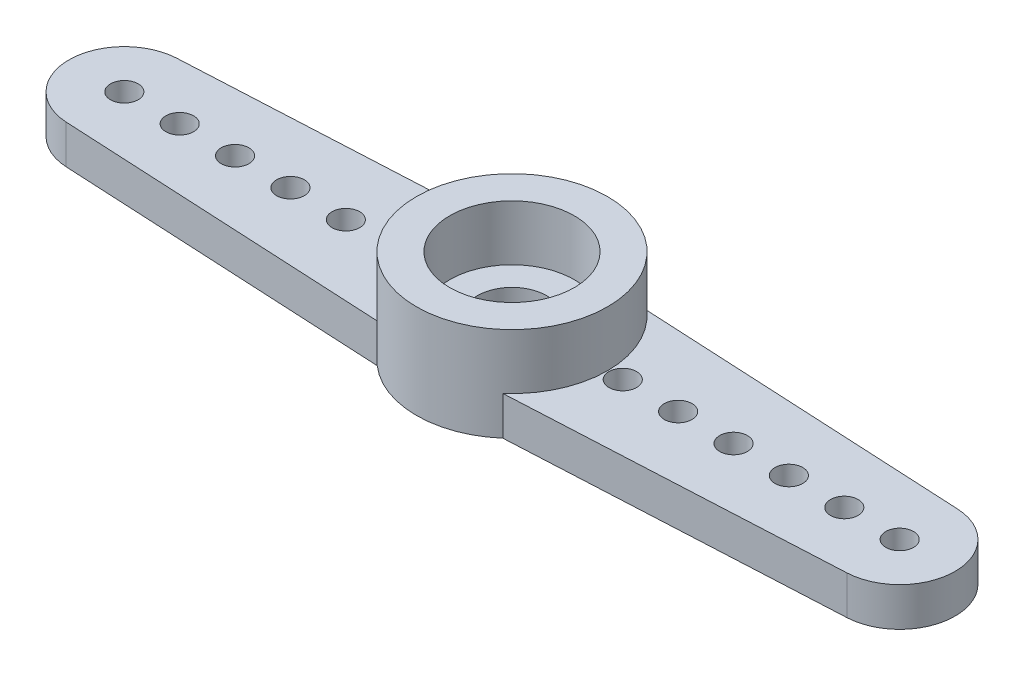
ISO-10303-21;
HEADER;
FILE_DESCRIPTION(('STEP AP214'),'2;1');
FILE_NAME('part.step','',(''),(''),'','','');
FILE_SCHEMA(('AUTOMOTIVE_DESIGN { 1 0 10303 214 1 1 1 1 }'));
ENDSEC;
DATA;
#1=APPLICATION_CONTEXT('core data for automotive mechanical design processes');
#2=APPLICATION_PROTOCOL_DEFINITION('international standard','automotive_design',2000,#1);
#3=PRODUCT_CONTEXT('',#1,'mechanical');
#4=PRODUCT('Part','Part','',(#3));
#5=PRODUCT_RELATED_PRODUCT_CATEGORY('part','',(#4));
#6=PRODUCT_DEFINITION_FORMATION('','',#4);
#7=PRODUCT_DEFINITION_CONTEXT('part definition',#1,'design');
#8=PRODUCT_DEFINITION('design','',#6,#7);
#9=PRODUCT_DEFINITION_SHAPE('','',#8);
#10=(LENGTH_UNIT() NAMED_UNIT(*) SI_UNIT(.MILLI.,.METRE.));
#11=(NAMED_UNIT(*) PLANE_ANGLE_UNIT() SI_UNIT($,.RADIAN.));
#12=(NAMED_UNIT(*) SI_UNIT($,.STERADIAN.) SOLID_ANGLE_UNIT());
#13=UNCERTAINTY_MEASURE_WITH_UNIT(LENGTH_MEASURE(1.E-05),#10,'distance_accuracy_value','');
#14=(GEOMETRIC_REPRESENTATION_CONTEXT(3) GLOBAL_UNCERTAINTY_ASSIGNED_CONTEXT((#13)) GLOBAL_UNIT_ASSIGNED_CONTEXT((#10,
#11,#12)) REPRESENTATION_CONTEXT('',''));
#15=CARTESIAN_POINT('',(0.,0.,0.));
#16=DIRECTION('',(0.,0.,1.));
#17=DIRECTION('',(1.,0.,0.));
#18=AXIS2_PLACEMENT_3D('',#15,#16,#17);
#19=CARTESIAN_POINT('',(-14.,1.4,0.));
#20=DIRECTION('',(0.,1.,0.));
#21=DIRECTION('',(0.,0.,1.));
#22=AXIS2_PLACEMENT_3D('',#19,#20,#21);
#23=PLANE('',#22);
#24=CARTESIAN_POINT('',(4.,1.4,0.));
#25=DIRECTION('',(0.,1.,0.));
#26=DIRECTION('',(0.,0.,1.));
#27=AXIS2_PLACEMENT_3D('',#24,#25,#26);
#28=CIRCLE('',#27,0.5);
#29=CARTESIAN_POINT('',(4.,1.4,0.5));
#30=VERTEX_POINT('',#29);
#31=EDGE_CURVE('E477',#30,#30,#28,.F.);
#32=ORIENTED_EDGE('',*,*,#31,.T.);
#33=EDGE_LOOP('',(#32));
#34=FACE_BOUND('',#33,.T.);
#35=CARTESIAN_POINT('',(6.,1.4,0.));
#36=DIRECTION('',(0.,1.,0.));
#37=DIRECTION('',(0.,0.,1.));
#38=AXIS2_PLACEMENT_3D('',#35,#36,#37);
#39=CIRCLE('',#38,0.5);
#40=CARTESIAN_POINT('',(6.,1.4,0.499999999999986));
#41=VERTEX_POINT('',#40);
#42=EDGE_CURVE('E510',#41,#41,#39,.F.);
#43=ORIENTED_EDGE('',*,*,#42,.T.);
#44=EDGE_LOOP('',(#43));
#45=FACE_BOUND('',#44,.T.);
#46=CARTESIAN_POINT('',(8.,1.4,0.));
#47=DIRECTION('',(0.,1.,0.));
#48=DIRECTION('',(0.,0.,1.));
#49=AXIS2_PLACEMENT_3D('',#46,#47,#48);
#50=CIRCLE('',#49,0.5);
#51=CARTESIAN_POINT('',(8.,1.4,0.499999999999972));
#52=VERTEX_POINT('',#51);
#53=EDGE_CURVE('E507',#52,#52,#50,.F.);
#54=ORIENTED_EDGE('',*,*,#53,.T.);
#55=EDGE_LOOP('',(#54));
#56=FACE_BOUND('',#55,.T.);
#57=CARTESIAN_POINT('',(10.,1.4,0.));
#58=DIRECTION('',(0.,1.,0.));
#59=DIRECTION('',(0.,0.,1.));
#60=AXIS2_PLACEMENT_3D('',#57,#58,#59);
#61=CIRCLE('',#60,0.500000000000001);
#62=CARTESIAN_POINT('',(10.,1.4,0.499999999999959));
#63=VERTEX_POINT('',#62);
#64=EDGE_CURVE('E504',#63,#63,#61,.F.);
#65=ORIENTED_EDGE('',*,*,#64,.T.);
#66=EDGE_LOOP('',(#65));
#67=FACE_BOUND('',#66,.T.);
#68=CARTESIAN_POINT('',(12.,1.4,0.));
#69=DIRECTION('',(0.,1.,0.));
#70=DIRECTION('',(0.,0.,1.));
#71=AXIS2_PLACEMENT_3D('',#68,#69,#70);
#72=CIRCLE('',#71,0.499999999999999);
#73=CARTESIAN_POINT('',(12.,1.4,0.499999999999943));
#74=VERTEX_POINT('',#73);
#75=EDGE_CURVE('E485',#74,#74,#72,.F.);
#76=ORIENTED_EDGE('',*,*,#75,.T.);
#77=EDGE_LOOP('',(#76));
#78=FACE_BOUND('',#77,.T.);
#79=CARTESIAN_POINT('',(14.,1.4,0.));
#80=DIRECTION('',(0.,1.,0.));
#81=DIRECTION('',(0.,0.,1.));
#82=AXIS2_PLACEMENT_3D('',#79,#80,#81);
#83=CIRCLE('',#82,0.500000000000001);
#84=CARTESIAN_POINT('',(14.,1.4,0.499999999999931));
#85=VERTEX_POINT('',#84);
#86=EDGE_CURVE('E481',#85,#85,#83,.F.);
#87=ORIENTED_EDGE('',*,*,#86,.T.);
#88=EDGE_LOOP('',(#87));
#89=FACE_BOUND('',#88,.T.);
#90=CARTESIAN_POINT('',(0.,1.4,0.));
#91=DIRECTION('',(0.,1.,0.));
#92=DIRECTION('',(0.,0.,1.));
#93=AXIS2_PLACEMENT_3D('',#90,#91,#92);
#94=CIRCLE('',#93,3.45);
#95=CARTESIAN_POINT('',(2.26770809408971,1.4,2.6));
#96=VERTEX_POINT('',#95);
#97=CARTESIAN_POINT('',(2.26770809408971,1.4,-2.6));
#98=VERTEX_POINT('',#97);
#99=EDGE_CURVE('E45',#96,#98,#94,.T.);
#100=ORIENTED_EDGE('',*,*,#99,.F.);
#101=DIRECTION('',(0.998706090170372,0.,-0.050854158695319));
#102=VECTOR('',#101,1.);
#103=CARTESIAN_POINT('',(14.1017083173906,1.4,1.99741218034074));
#104=LINE('',#103,#102);
#105=CARTESIAN_POINT('',(14.1017083173906,1.4,1.99741218034074));
#106=VERTEX_POINT('',#105);
#107=EDGE_CURVE('E145',#96,#106,#104,.T.);
#108=ORIENTED_EDGE('',*,*,#107,.T.);
#109=CARTESIAN_POINT('',(14.,1.4,0.));
#110=DIRECTION('',(0.,1.,0.));
#111=DIRECTION('',(0.,0.,-1.));
#112=AXIS2_PLACEMENT_3D('',#109,#110,#111);
#113=CIRCLE('',#112,2.);
#114=CARTESIAN_POINT('',(14.1017083173906,1.4,-1.99741218034074));
#115=VERTEX_POINT('',#114);
#116=EDGE_CURVE('E115',#106,#115,#113,.T.);
#117=ORIENTED_EDGE('',*,*,#116,.T.);
#118=DIRECTION('',(-0.998706090170372,0.,-0.050854158695319));
#119=VECTOR('',#118,1.);
#120=CARTESIAN_POINT('',(2.26770809408971,1.4,-2.6));
#121=LINE('',#120,#119);
#122=EDGE_CURVE('E111',#115,#98,#121,.T.);
#123=ORIENTED_EDGE('',*,*,#122,.T.);
#124=EDGE_LOOP('',(#100,#108,#117,#123));
#125=FACE_BOUND('',#124,.T.);
#126=ADVANCED_FACE('F33',(#34,#45,#56,#67,#78,#89,#125),#23,.T.);
#127=CARTESIAN_POINT('',(-14.,1.4,0.));
#128=DIRECTION('',(0.,-1.,0.));
#129=DIRECTION('',(0.,0.,-1.));
#130=AXIS2_PLACEMENT_3D('',#127,#128,#129);
#131=CYLINDRICAL_SURFACE('',#130,2.);
#132=CARTESIAN_POINT('',(-14.,0.,0.));
#133=DIRECTION('',(0.,1.,0.));
#134=DIRECTION('',(0.,0.,1.));
#135=AXIS2_PLACEMENT_3D('',#132,#133,#134);
#136=CIRCLE('',#135,2.);
#137=CARTESIAN_POINT('',(-14.1017083173906,0.,-1.99741218034074));
#138=VERTEX_POINT('',#137);
#139=CARTESIAN_POINT('',(-14.1017083173906,0.,1.99741218034074));
#140=VERTEX_POINT('',#139);
#141=EDGE_CURVE('E135',#138,#140,#136,.T.);
#142=ORIENTED_EDGE('',*,*,#141,.T.);
#143=DIRECTION('',(0.,-1.,0.));
#144=VECTOR('',#143,1.);
#145=CARTESIAN_POINT('',(-14.1017083173906,1.4,1.99741218034074));
#146=LINE('',#145,#144);
#147=CARTESIAN_POINT('',(-14.1017083173906,1.4,1.99741218034074));
#148=VERTEX_POINT('',#147);
#149=EDGE_CURVE('E43',#148,#140,#146,.T.);
#150=ORIENTED_EDGE('',*,*,#149,.F.);
#151=CARTESIAN_POINT('',(-14.,1.4,0.));
#152=DIRECTION('',(0.,1.,0.));
#153=DIRECTION('',(0.,0.,1.));
#154=AXIS2_PLACEMENT_3D('',#151,#152,#153);
#155=CIRCLE('',#154,2.);
#156=CARTESIAN_POINT('',(-14.1017083173906,1.4,-1.99741218034074));
#157=VERTEX_POINT('',#156);
#158=EDGE_CURVE('E142',#157,#148,#155,.T.);
#159=ORIENTED_EDGE('',*,*,#158,.F.);
#160=DIRECTION('',(0.,-1.,0.));
#161=VECTOR('',#160,1.);
#162=CARTESIAN_POINT('',(-14.1017083173906,1.4,-1.99741218034074));
#163=LINE('',#162,#161);
#164=EDGE_CURVE('E149',#157,#138,#163,.T.);
#165=ORIENTED_EDGE('',*,*,#164,.T.);
#166=EDGE_LOOP('',(#142,#150,#159,#165));
#167=FACE_BOUND('',#166,.T.);
#168=ADVANCED_FACE('F35',(#167),#131,.T.);
#169=CARTESIAN_POINT('',(-2.26770809408971,1.4,2.6));
#170=DIRECTION('',(0.050854158695319,0.,-0.998706090170372));
#171=DIRECTION('',(-0.998706090170372,0.,-0.050854158695319));
#172=AXIS2_PLACEMENT_3D('',#169,#170,#171);
#173=PLANE('',#172);
#174=DIRECTION('',(0.998706090170372,0.,0.050854158695319));
#175=VECTOR('',#174,1.);
#176=CARTESIAN_POINT('',(-2.26770809408971,0.,2.6));
#177=LINE('',#176,#175);
#178=CARTESIAN_POINT('',(-2.26770809408971,0.,2.6));
#179=VERTEX_POINT('',#178);
#180=EDGE_CURVE('E152',#140,#179,#177,.T.);
#181=ORIENTED_EDGE('',*,*,#180,.T.);
#182=DIRECTION('',(0.,-1.,0.));
#183=VECTOR('',#182,1.);
#184=CARTESIAN_POINT('',(-2.26770809408971,1.4,2.6));
#185=LINE('',#184,#183);
#186=CARTESIAN_POINT('',(-2.26770809408971,1.4,2.6));
#187=VERTEX_POINT('',#186);
#188=EDGE_CURVE('E170',#187,#179,#185,.T.);
#189=ORIENTED_EDGE('',*,*,#188,.F.);
#190=DIRECTION('',(0.998706090170372,0.,0.050854158695319));
#191=VECTOR('',#190,1.);
#192=CARTESIAN_POINT('',(-2.26770809408971,1.4,2.6));
#193=LINE('',#192,#191);
#194=EDGE_CURVE('E98',#148,#187,#193,.T.);
#195=ORIENTED_EDGE('',*,*,#194,.F.);
#196=ORIENTED_EDGE('',*,*,#149,.T.);
#197=EDGE_LOOP('',(#181,#189,#195,#196));
#198=FACE_BOUND('',#197,.T.);
#199=ADVANCED_FACE('F173',(#198),#173,.F.);
#200=CARTESIAN_POINT('',(14.1017083173906,1.4,1.99741218034074));
#201=DIRECTION('',(-0.050854158695319,0.,-0.998706090170372));
#202=DIRECTION('',(-0.998706090170372,0.,0.050854158695319));
#203=AXIS2_PLACEMENT_3D('',#200,#201,#202);
#204=PLANE('',#203);
#205=DIRECTION('',(0.998706090170372,0.,-0.050854158695319));
#206=VECTOR('',#205,1.);
#207=CARTESIAN_POINT('',(14.1017083173906,0.,1.99741218034074));
#208=LINE('',#207,#206);
#209=CARTESIAN_POINT('',(2.26770809408971,0.,2.6));
#210=VERTEX_POINT('',#209);
#211=CARTESIAN_POINT('',(14.1017083173906,0.,1.99741218034074));
#212=VERTEX_POINT('',#211);
#213=EDGE_CURVE('E156',#210,#212,#208,.T.);
#214=ORIENTED_EDGE('',*,*,#213,.T.);
#215=DIRECTION('',(0.,-1.,0.));
#216=VECTOR('',#215,1.);
#217=CARTESIAN_POINT('',(14.1017083173906,1.4,1.99741218034074));
#218=LINE('',#217,#216);
#219=EDGE_CURVE('E166',#106,#212,#218,.T.);
#220=ORIENTED_EDGE('',*,*,#219,.F.);
#221=ORIENTED_EDGE('',*,*,#107,.F.);
#222=DIRECTION('',(0.,-1.,0.));
#223=VECTOR('',#222,1.);
#224=CARTESIAN_POINT('',(2.26770809408971,1.4,2.6));
#225=LINE('',#224,#223);
#226=EDGE_CURVE('E131',#96,#210,#225,.T.);
#227=ORIENTED_EDGE('',*,*,#226,.T.);
#228=EDGE_LOOP('',(#214,#220,#221,#227));
#229=FACE_BOUND('',#228,.T.);
#230=ADVANCED_FACE('F184',(#229),#204,.F.);
#231=CARTESIAN_POINT('',(14.,1.4,0.));
#232=DIRECTION('',(0.,-1.,0.));
#233=DIRECTION('',(0.,0.,-1.));
#234=AXIS2_PLACEMENT_3D('',#231,#232,#233);
#235=CYLINDRICAL_SURFACE('',#234,2.);
#236=CARTESIAN_POINT('',(14.,0.,0.));
#237=DIRECTION('',(0.,1.,0.));
#238=DIRECTION('',(0.,0.,-1.));
#239=AXIS2_PLACEMENT_3D('',#236,#237,#238);
#240=CIRCLE('',#239,2.);
#241=CARTESIAN_POINT('',(14.1017083173906,0.,-1.99741218034074));
#242=VERTEX_POINT('',#241);
#243=EDGE_CURVE('E158',#212,#242,#240,.T.);
#244=ORIENTED_EDGE('',*,*,#243,.T.);
#245=DIRECTION('',(0.,-1.,0.));
#246=VECTOR('',#245,1.);
#247=CARTESIAN_POINT('',(14.1017083173906,1.4,-1.99741218034074));
#248=LINE('',#247,#246);
#249=EDGE_CURVE('E124',#115,#242,#248,.T.);
#250=ORIENTED_EDGE('',*,*,#249,.F.);
#251=ORIENTED_EDGE('',*,*,#116,.F.);
#252=ORIENTED_EDGE('',*,*,#219,.T.);
#253=EDGE_LOOP('',(#244,#250,#251,#252));
#254=FACE_BOUND('',#253,.T.);
#255=ADVANCED_FACE('F187',(#254),#235,.T.);
#256=CARTESIAN_POINT('',(2.26770809408971,1.4,-2.6));
#257=DIRECTION('',(-0.050854158695319,0.,0.998706090170372));
#258=DIRECTION('',(0.998706090170372,0.,0.050854158695319));
#259=AXIS2_PLACEMENT_3D('',#256,#257,#258);
#260=PLANE('',#259);
#261=DIRECTION('',(-0.998706090170372,0.,-0.050854158695319));
#262=VECTOR('',#261,1.);
#263=CARTESIAN_POINT('',(2.26770809408971,0.,-2.6));
#264=LINE('',#263,#262);
#265=CARTESIAN_POINT('',(2.26770809408971,0.,-2.6));
#266=VERTEX_POINT('',#265);
#267=EDGE_CURVE('E123',#242,#266,#264,.T.);
#268=ORIENTED_EDGE('',*,*,#267,.T.);
#269=DIRECTION('',(0.,-1.,0.));
#270=VECTOR('',#269,1.);
#271=CARTESIAN_POINT('',(2.26770809408971,1.4,-2.6));
#272=LINE('',#271,#270);
#273=EDGE_CURVE('E120',#98,#266,#272,.T.);
#274=ORIENTED_EDGE('',*,*,#273,.F.);
#275=ORIENTED_EDGE('',*,*,#122,.F.);
#276=ORIENTED_EDGE('',*,*,#249,.T.);
#277=EDGE_LOOP('',(#268,#274,#275,#276));
#278=FACE_BOUND('',#277,.T.);
#279=ADVANCED_FACE('F121',(#278),#260,.F.);
#280=CARTESIAN_POINT('',(0.,1.4,0.));
#281=DIRECTION('',(0.,-1.,0.));
#282=DIRECTION('',(0.,0.,-1.));
#283=AXIS2_PLACEMENT_3D('',#280,#281,#282);
#284=CYLINDRICAL_SURFACE('',#283,3.45);
#285=CARTESIAN_POINT('',(0.,0.,0.));
#286=DIRECTION('',(0.,1.,0.));
#287=DIRECTION('',(0.,0.,-1.));
#288=AXIS2_PLACEMENT_3D('',#285,#286,#287);
#289=CIRCLE('',#288,3.45);
#290=CARTESIAN_POINT('',(-2.26770809408971,0.,-2.6));
#291=VERTEX_POINT('',#290);
#292=EDGE_CURVE('E83',#266,#291,#289,.T.);
#293=ORIENTED_EDGE('',*,*,#292,.T.);
#294=DIRECTION('',(0.,-1.,0.));
#295=VECTOR('',#294,1.);
#296=CARTESIAN_POINT('',(-2.26770809408971,1.4,-2.6));
#297=LINE('',#296,#295);
#298=CARTESIAN_POINT('',(-2.26770809408971,1.4,-2.6));
#299=VERTEX_POINT('',#298);
#300=EDGE_CURVE('E125',#299,#291,#297,.T.);
#301=ORIENTED_EDGE('',*,*,#300,.F.);
#302=EDGE_CURVE('E11',#299,#187,#94,.T.);
#303=ORIENTED_EDGE('',*,*,#302,.T.);
#304=ORIENTED_EDGE('',*,*,#188,.T.);
#305=CARTESIAN_POINT('',(0.,0.,0.));
#306=DIRECTION('',(0.,1.,0.));
#307=DIRECTION('',(0.,0.,1.));
#308=AXIS2_PLACEMENT_3D('',#305,#306,#307);
#309=CIRCLE('',#308,3.45);
#310=EDGE_CURVE('E154',#179,#210,#309,.T.);
#311=ORIENTED_EDGE('',*,*,#310,.T.);
#312=ORIENTED_EDGE('',*,*,#226,.F.);
#313=ORIENTED_EDGE('',*,*,#99,.T.);
#314=ORIENTED_EDGE('',*,*,#273,.T.);
#315=EDGE_LOOP('',(#293,#301,#303,#304,#311,#312,#313,#314));
#316=FACE_BOUND('',#315,.T.);
#317=CARTESIAN_POINT('',(0.,3.4,0.));
#318=DIRECTION('',(0.,1.,0.));
#319=DIRECTION('',(0.,0.,1.));
#320=AXIS2_PLACEMENT_3D('',#317,#318,#319);
#321=CIRCLE('',#320,3.45);
#322=CARTESIAN_POINT('',(0.,3.4,3.45));
#323=VERTEX_POINT('',#322);
#324=EDGE_CURVE('E132',#323,#323,#321,.T.);
#325=ORIENTED_EDGE('',*,*,#324,.F.);
#326=EDGE_LOOP('',(#325));
#327=FACE_BOUND('',#326,.T.);
#328=ADVANCED_FACE('F128',(#316,#327),#284,.T.);
#329=CARTESIAN_POINT('',(-14.1017083173906,1.4,-1.99741218034074));
#330=DIRECTION('',(0.050854158695319,0.,0.998706090170372));
#331=DIRECTION('',(0.998706090170372,0.,-0.050854158695319));
#332=AXIS2_PLACEMENT_3D('',#329,#330,#331);
#333=PLANE('',#332);
#334=DIRECTION('',(-0.998706090170372,0.,0.050854158695319));
#335=VECTOR('',#334,1.);
#336=CARTESIAN_POINT('',(-14.1017083173906,0.,-1.99741218034074));
#337=LINE('',#336,#335);
#338=EDGE_CURVE('E89',#291,#138,#337,.T.);
#339=ORIENTED_EDGE('',*,*,#338,.T.);
#340=ORIENTED_EDGE('',*,*,#164,.F.);
#341=DIRECTION('',(-0.998706090170372,0.,0.050854158695319));
#342=VECTOR('',#341,1.);
#343=CARTESIAN_POINT('',(-14.1017083173906,1.4,-1.99741218034074));
#344=LINE('',#343,#342);
#345=EDGE_CURVE('E53',#299,#157,#344,.T.);
#346=ORIENTED_EDGE('',*,*,#345,.F.);
#347=ORIENTED_EDGE('',*,*,#300,.T.);
#348=EDGE_LOOP('',(#339,#340,#346,#347));
#349=FACE_BOUND('',#348,.T.);
#350=ADVANCED_FACE('F208',(#349),#333,.F.);
#351=CARTESIAN_POINT('',(-4.,1.4,0.));
#352=DIRECTION('',(0.,1.,0.));
#353=DIRECTION('',(0.,0.,1.));
#354=AXIS2_PLACEMENT_3D('',#351,#352,#353);
#355=CIRCLE('',#354,0.5);
#356=CARTESIAN_POINT('',(-4.,1.4,0.5));
#357=VERTEX_POINT('',#356);
#358=EDGE_CURVE('E220',#357,#357,#355,.T.);
#359=ORIENTED_EDGE('',*,*,#358,.F.);
#360=EDGE_LOOP('',(#359));
#361=FACE_BOUND('',#360,.T.);
#362=CARTESIAN_POINT('',(-6.,1.4,0.));
#363=DIRECTION('',(0.,1.,0.));
#364=DIRECTION('',(0.,0.,1.));
#365=AXIS2_PLACEMENT_3D('',#362,#363,#364);
#366=CIRCLE('',#365,0.5);
#367=CARTESIAN_POINT('',(-6.,1.4,0.499999999999986));
#368=VERTEX_POINT('',#367);
#369=EDGE_CURVE('E224',#368,#368,#366,.T.);
#370=ORIENTED_EDGE('',*,*,#369,.F.);
#371=EDGE_LOOP('',(#370));
#372=FACE_BOUND('',#371,.T.);
#373=CARTESIAN_POINT('',(-8.,1.4,0.));
#374=DIRECTION('',(0.,1.,0.));
#375=DIRECTION('',(0.,0.,1.));
#376=AXIS2_PLACEMENT_3D('',#373,#374,#375);
#377=CIRCLE('',#376,0.5);
#378=CARTESIAN_POINT('',(-8.,1.4,0.499999999999972));
#379=VERTEX_POINT('',#378);
#380=EDGE_CURVE('E228',#379,#379,#377,.T.);
#381=ORIENTED_EDGE('',*,*,#380,.F.);
#382=EDGE_LOOP('',(#381));
#383=FACE_BOUND('',#382,.T.);
#384=CARTESIAN_POINT('',(-10.,1.4,0.));
#385=DIRECTION('',(0.,1.,0.));
#386=DIRECTION('',(0.,0.,1.));
#387=AXIS2_PLACEMENT_3D('',#384,#385,#386);
#388=CIRCLE('',#387,0.500000000000001);
#389=CARTESIAN_POINT('',(-10.,1.4,0.499999999999959));
#390=VERTEX_POINT('',#389);
#391=EDGE_CURVE('E232',#390,#390,#388,.T.);
#392=ORIENTED_EDGE('',*,*,#391,.F.);
#393=EDGE_LOOP('',(#392));
#394=FACE_BOUND('',#393,.T.);
#395=CARTESIAN_POINT('',(-12.,1.4,0.));
#396=DIRECTION('',(0.,1.,0.));
#397=DIRECTION('',(0.,0.,1.));
#398=AXIS2_PLACEMENT_3D('',#395,#396,#397);
#399=CIRCLE('',#398,0.499999999999999);
#400=CARTESIAN_POINT('',(-12.,1.4,0.499999999999943));
#401=VERTEX_POINT('',#400);
#402=EDGE_CURVE('E236',#401,#401,#399,.T.);
#403=ORIENTED_EDGE('',*,*,#402,.F.);
#404=EDGE_LOOP('',(#403));
#405=FACE_BOUND('',#404,.T.);
#406=CARTESIAN_POINT('',(-14.,1.4,0.));
#407=DIRECTION('',(0.,1.,0.));
#408=DIRECTION('',(0.,0.,1.));
#409=AXIS2_PLACEMENT_3D('',#406,#407,#408);
#410=CIRCLE('',#409,0.500000000000001);
#411=CARTESIAN_POINT('',(-14.,1.4,0.499999999999931));
#412=VERTEX_POINT('',#411);
#413=EDGE_CURVE('E239',#412,#412,#410,.T.);
#414=ORIENTED_EDGE('',*,*,#413,.F.);
#415=EDGE_LOOP('',(#414));
#416=FACE_BOUND('',#415,.T.);
#417=ORIENTED_EDGE('',*,*,#302,.F.);
#418=ORIENTED_EDGE('',*,*,#345,.T.);
#419=ORIENTED_EDGE('',*,*,#158,.T.);
#420=ORIENTED_EDGE('',*,*,#194,.T.);
#421=EDGE_LOOP('',(#417,#418,#419,#420));
#422=FACE_BOUND('',#421,.T.);
#423=ADVANCED_FACE('F199',(#361,#372,#383,#394,#405,#416,#422),#23,.T.);
#424=CARTESIAN_POINT('',(-14.,0.,0.));
#425=DIRECTION('',(0.,1.,0.));
#426=DIRECTION('',(0.,0.,1.));
#427=AXIS2_PLACEMENT_3D('',#424,#425,#426);
#428=PLANE('',#427);
#429=CARTESIAN_POINT('',(4.,0.,0.));
#430=DIRECTION('',(0.,1.,0.));
#431=DIRECTION('',(0.,0.,-1.));
#432=AXIS2_PLACEMENT_3D('',#429,#430,#431);
#433=CIRCLE('',#432,0.5);
#434=CARTESIAN_POINT('',(4.,0.,-0.5));
#435=VERTEX_POINT('',#434);
#436=EDGE_CURVE('E480',#435,#435,#433,.T.);
#437=ORIENTED_EDGE('',*,*,#436,.T.);
#438=EDGE_LOOP('',(#437));
#439=FACE_BOUND('',#438,.T.);
#440=CARTESIAN_POINT('',(6.,0.,0.));
#441=DIRECTION('',(0.,1.,0.));
#442=DIRECTION('',(0.,0.,-1.));
#443=AXIS2_PLACEMENT_3D('',#440,#441,#442);
#444=CIRCLE('',#443,0.5);
#445=CARTESIAN_POINT('',(6.,0.,-0.500000000000014));
#446=VERTEX_POINT('',#445);
#447=EDGE_CURVE('E482',#446,#446,#444,.T.);
#448=ORIENTED_EDGE('',*,*,#447,.T.);
#449=EDGE_LOOP('',(#448));
#450=FACE_BOUND('',#449,.T.);
#451=CARTESIAN_POINT('',(8.,0.,0.));
#452=DIRECTION('',(0.,1.,0.));
#453=DIRECTION('',(0.,0.,-1.));
#454=AXIS2_PLACEMENT_3D('',#451,#452,#453);
#455=CIRCLE('',#454,0.5);
#456=CARTESIAN_POINT('',(8.,0.,-0.500000000000028));
#457=VERTEX_POINT('',#456);
#458=EDGE_CURVE('E488',#457,#457,#455,.T.);
#459=ORIENTED_EDGE('',*,*,#458,.T.);
#460=EDGE_LOOP('',(#459));
#461=FACE_BOUND('',#460,.T.);
#462=CARTESIAN_POINT('',(10.,0.,0.));
#463=DIRECTION('',(0.,1.,0.));
#464=DIRECTION('',(0.,0.,-1.));
#465=AXIS2_PLACEMENT_3D('',#462,#463,#464);
#466=CIRCLE('',#465,0.500000000000001);
#467=CARTESIAN_POINT('',(10.,0.,-0.500000000000043));
#468=VERTEX_POINT('',#467);
#469=EDGE_CURVE('E493',#468,#468,#466,.T.);
#470=ORIENTED_EDGE('',*,*,#469,.T.);
#471=EDGE_LOOP('',(#470));
#472=FACE_BOUND('',#471,.T.);
#473=CARTESIAN_POINT('',(12.,0.,0.));
#474=DIRECTION('',(0.,1.,0.));
#475=DIRECTION('',(0.,0.,-1.));
#476=AXIS2_PLACEMENT_3D('',#473,#474,#475);
#477=CIRCLE('',#476,0.499999999999999);
#478=CARTESIAN_POINT('',(12.,0.,-0.500000000000055));
#479=VERTEX_POINT('',#478);
#480=EDGE_CURVE('E496',#479,#479,#477,.T.);
#481=ORIENTED_EDGE('',*,*,#480,.T.);
#482=EDGE_LOOP('',(#481));
#483=FACE_BOUND('',#482,.T.);
#484=CARTESIAN_POINT('',(14.,0.,0.));
#485=DIRECTION('',(0.,1.,0.));
#486=DIRECTION('',(0.,0.,-1.));
#487=AXIS2_PLACEMENT_3D('',#484,#485,#486);
#488=CIRCLE('',#487,0.500000000000001);
#489=CARTESIAN_POINT('',(14.,0.,-0.500000000000071));
#490=VERTEX_POINT('',#489);
#491=EDGE_CURVE('E499',#490,#490,#488,.T.);
#492=ORIENTED_EDGE('',*,*,#491,.T.);
#493=EDGE_LOOP('',(#492));
#494=FACE_BOUND('',#493,.T.);
#495=CARTESIAN_POINT('',(-4.,0.,0.));
#496=DIRECTION('',(0.,-1.,0.));
#497=DIRECTION('',(0.,0.,-1.));
#498=AXIS2_PLACEMENT_3D('',#495,#496,#497);
#499=CIRCLE('',#498,0.5);
#500=CARTESIAN_POINT('',(-4.,0.,-0.5));
#501=VERTEX_POINT('',#500);
#502=EDGE_CURVE('E241',#501,#501,#499,.T.);
#503=ORIENTED_EDGE('',*,*,#502,.F.);
#504=EDGE_LOOP('',(#503));
#505=FACE_BOUND('',#504,.T.);
#506=CARTESIAN_POINT('',(-6.,0.,0.));
#507=DIRECTION('',(0.,-1.,0.));
#508=DIRECTION('',(0.,0.,-1.));
#509=AXIS2_PLACEMENT_3D('',#506,#507,#508);
#510=CIRCLE('',#509,0.5);
#511=CARTESIAN_POINT('',(-6.,0.,-0.500000000000014));
#512=VERTEX_POINT('',#511);
#513=EDGE_CURVE('E245',#512,#512,#510,.T.);
#514=ORIENTED_EDGE('',*,*,#513,.F.);
#515=EDGE_LOOP('',(#514));
#516=FACE_BOUND('',#515,.T.);
#517=CARTESIAN_POINT('',(-8.,0.,0.));
#518=DIRECTION('',(0.,-1.,0.));
#519=DIRECTION('',(0.,0.,-1.));
#520=AXIS2_PLACEMENT_3D('',#517,#518,#519);
#521=CIRCLE('',#520,0.5);
#522=CARTESIAN_POINT('',(-8.,0.,-0.500000000000028));
#523=VERTEX_POINT('',#522);
#524=EDGE_CURVE('E516',#523,#523,#521,.T.);
#525=ORIENTED_EDGE('',*,*,#524,.F.);
#526=EDGE_LOOP('',(#525));
#527=FACE_BOUND('',#526,.T.);
#528=CARTESIAN_POINT('',(-10.,0.,0.));
#529=DIRECTION('',(0.,-1.,0.));
#530=DIRECTION('',(0.,0.,-1.));
#531=AXIS2_PLACEMENT_3D('',#528,#529,#530);
#532=CIRCLE('',#531,0.500000000000001);
#533=CARTESIAN_POINT('',(-10.,0.,-0.500000000000043));
#534=VERTEX_POINT('',#533);
#535=EDGE_CURVE('E519',#534,#534,#532,.T.);
#536=ORIENTED_EDGE('',*,*,#535,.F.);
#537=EDGE_LOOP('',(#536));
#538=FACE_BOUND('',#537,.T.);
#539=CARTESIAN_POINT('',(-12.,0.,0.));
#540=DIRECTION('',(0.,-1.,0.));
#541=DIRECTION('',(0.,0.,-1.));
#542=AXIS2_PLACEMENT_3D('',#539,#540,#541);
#543=CIRCLE('',#542,0.499999999999999);
#544=CARTESIAN_POINT('',(-12.,0.,-0.500000000000055));
#545=VERTEX_POINT('',#544);
#546=EDGE_CURVE('E521',#545,#545,#543,.T.);
#547=ORIENTED_EDGE('',*,*,#546,.F.);
#548=EDGE_LOOP('',(#547));
#549=FACE_BOUND('',#548,.T.);
#550=CARTESIAN_POINT('',(-14.,0.,0.));
#551=DIRECTION('',(0.,-1.,0.));
#552=DIRECTION('',(0.,0.,-1.));
#553=AXIS2_PLACEMENT_3D('',#550,#551,#552);
#554=CIRCLE('',#553,0.500000000000001);
#555=CARTESIAN_POINT('',(-14.,0.,-0.500000000000071));
#556=VERTEX_POINT('',#555);
#557=EDGE_CURVE('E248',#556,#556,#554,.T.);
#558=ORIENTED_EDGE('',*,*,#557,.F.);
#559=EDGE_LOOP('',(#558));
#560=FACE_BOUND('',#559,.T.);
#561=CARTESIAN_POINT('',(0.,0.,0.));
#562=DIRECTION('',(0.,-1.,0.));
#563=DIRECTION('',(0.,0.,-1.));
#564=AXIS2_PLACEMENT_3D('',#561,#562,#563);
#565=CIRCLE('',#564,2.25);
#566=CARTESIAN_POINT('',(0.,0.,-2.25));
#567=VERTEX_POINT('',#566);
#568=EDGE_CURVE('E261',#567,#567,#565,.T.);
#569=ORIENTED_EDGE('',*,*,#568,.F.);
#570=EDGE_LOOP('',(#569));
#571=FACE_BOUND('',#570,.T.);
#572=ORIENTED_EDGE('',*,*,#141,.F.);
#573=ORIENTED_EDGE('',*,*,#338,.F.);
#574=ORIENTED_EDGE('',*,*,#292,.F.);
#575=ORIENTED_EDGE('',*,*,#267,.F.);
#576=ORIENTED_EDGE('',*,*,#243,.F.);
#577=ORIENTED_EDGE('',*,*,#213,.F.);
#578=ORIENTED_EDGE('',*,*,#310,.F.);
#579=ORIENTED_EDGE('',*,*,#180,.F.);
#580=EDGE_LOOP('',(#572,#573,#574,#575,#576,#577,#578,#579));
#581=FACE_BOUND('',#580,.T.);
#582=ADVANCED_FACE('F178',(#439,#450,#461,#472,#483,#494,#505,#516,#527,#538,#549,#560,#571,
#581),#428,.F.);
#583=CARTESIAN_POINT('',(0.,3.4,0.));
#584=DIRECTION('',(0.,1.,0.));
#585=DIRECTION('',(0.,0.,1.));
#586=AXIS2_PLACEMENT_3D('',#583,#584,#585);
#587=PLANE('',#586);
#588=CARTESIAN_POINT('',(0.,3.4,0.));
#589=DIRECTION('',(0.,1.,0.));
#590=DIRECTION('',(0.,0.,1.));
#591=AXIS2_PLACEMENT_3D('',#588,#589,#590);
#592=CIRCLE('',#591,2.25);
#593=CARTESIAN_POINT('',(0.,3.4,2.25));
#594=VERTEX_POINT('',#593);
#595=EDGE_CURVE('E138',#594,#594,#592,.T.);
#596=ORIENTED_EDGE('',*,*,#595,.F.);
#597=EDGE_LOOP('',(#596));
#598=FACE_BOUND('',#597,.T.);
#599=ORIENTED_EDGE('',*,*,#324,.T.);
#600=EDGE_LOOP('',(#599));
#601=FACE_BOUND('',#600,.T.);
#602=ADVANCED_FACE('F214',(#598,#601),#587,.T.);
#603=CARTESIAN_POINT('',(0.,1.4,0.));
#604=DIRECTION('',(0.,1.,0.));
#605=DIRECTION('',(0.,0.,1.));
#606=AXIS2_PLACEMENT_3D('',#603,#604,#605);
#607=CYLINDRICAL_SURFACE('',#606,2.25);
#608=CARTESIAN_POINT('',(0.,1.4,0.));
#609=DIRECTION('',(0.,1.,0.));
#610=DIRECTION('',(0.,0.,1.));
#611=AXIS2_PLACEMENT_3D('',#608,#609,#610);
#612=CIRCLE('',#611,2.25);
#613=CARTESIAN_POINT('',(0.,1.4,2.25));
#614=VERTEX_POINT('',#613);
#615=EDGE_CURVE('E133',#614,#614,#612,.T.);
#616=ORIENTED_EDGE('',*,*,#615,.F.);
#617=EDGE_LOOP('',(#616));
#618=FACE_BOUND('',#617,.T.);
#619=ORIENTED_EDGE('',*,*,#595,.T.);
#620=EDGE_LOOP('',(#619));
#621=FACE_BOUND('',#620,.T.);
#622=ADVANCED_FACE('F266',(#618,#621),#607,.F.);
#623=CARTESIAN_POINT('',(0.,1.4,0.));
#624=DIRECTION('',(0.,1.,0.));
#625=DIRECTION('',(0.,0.,1.));
#626=AXIS2_PLACEMENT_3D('',#623,#624,#625);
#627=PLANE('',#626);
#628=CARTESIAN_POINT('',(0.,1.4,0.));
#629=DIRECTION('',(0.,1.,0.));
#630=DIRECTION('',(0.,0.,1.));
#631=AXIS2_PLACEMENT_3D('',#628,#629,#630);
#632=CIRCLE('',#631,1.25);
#633=CARTESIAN_POINT('',(0.,1.4,1.25));
#634=VERTEX_POINT('',#633);
#635=EDGE_CURVE('E37',#634,#634,#632,.T.);
#636=ORIENTED_EDGE('',*,*,#635,.F.);
#637=EDGE_LOOP('',(#636));
#638=FACE_BOUND('',#637,.T.);
#639=ORIENTED_EDGE('',*,*,#615,.T.);
#640=EDGE_LOOP('',(#639));
#641=FACE_BOUND('',#640,.T.);
#642=ADVANCED_FACE('F298',(#638,#641),#627,.T.);
#643=CARTESIAN_POINT('',(0.,0.5,0.));
#644=DIRECTION('',(0.,-1.,0.));
#645=DIRECTION('',(0.,0.,-1.));
#646=AXIS2_PLACEMENT_3D('',#643,#644,#645);
#647=CYLINDRICAL_SURFACE('',#646,2.25);
#648=CARTESIAN_POINT('',(0.,0.5,0.));
#649=DIRECTION('',(0.,-1.,0.));
#650=DIRECTION('',(0.,0.,-1.));
#651=AXIS2_PLACEMENT_3D('',#648,#649,#650);
#652=CIRCLE('',#651,2.25);
#653=CARTESIAN_POINT('',(0.,0.5,-2.25));
#654=VERTEX_POINT('',#653);
#655=EDGE_CURVE('E258',#654,#654,#652,.T.);
#656=ORIENTED_EDGE('',*,*,#655,.F.);
#657=EDGE_LOOP('',(#656));
#658=FACE_BOUND('',#657,.T.);
#659=ORIENTED_EDGE('',*,*,#568,.T.);
#660=EDGE_LOOP('',(#659));
#661=FACE_BOUND('',#660,.T.);
#662=ADVANCED_FACE('F306',(#658,#661),#647,.F.);
#663=CARTESIAN_POINT('',(0.,0.5,0.));
#664=DIRECTION('',(0.,-1.,0.));
#665=DIRECTION('',(0.,0.,-1.));
#666=AXIS2_PLACEMENT_3D('',#663,#664,#665);
#667=PLANE('',#666);
#668=CARTESIAN_POINT('',(0.,0.5,0.));
#669=DIRECTION('',(0.,-1.,0.));
#670=DIRECTION('',(0.,0.,-1.));
#671=AXIS2_PLACEMENT_3D('',#668,#669,#670);
#672=CIRCLE('',#671,1.25);
#673=CARTESIAN_POINT('',(0.,0.5,-1.25));
#674=VERTEX_POINT('',#673);
#675=EDGE_CURVE('E255',#674,#674,#672,.T.);
#676=ORIENTED_EDGE('',*,*,#675,.F.);
#677=EDGE_LOOP('',(#676));
#678=FACE_BOUND('',#677,.T.);
#679=ORIENTED_EDGE('',*,*,#655,.T.);
#680=EDGE_LOOP('',(#679));
#681=FACE_BOUND('',#680,.T.);
#682=ADVANCED_FACE('F311',(#678,#681),#667,.T.);
#683=CARTESIAN_POINT('',(0.,3.4,0.));
#684=DIRECTION('',(0.,-1.,0.));
#685=DIRECTION('',(0.,0.,-1.));
#686=AXIS2_PLACEMENT_3D('',#683,#684,#685);
#687=CYLINDRICAL_SURFACE('',#686,1.25);
#688=ORIENTED_EDGE('',*,*,#635,.T.);
#689=EDGE_LOOP('',(#688));
#690=FACE_BOUND('',#689,.T.);
#691=ORIENTED_EDGE('',*,*,#675,.T.);
#692=EDGE_LOOP('',(#691));
#693=FACE_BOUND('',#692,.T.);
#694=ADVANCED_FACE('F328',(#690,#693),#687,.F.);
#695=CARTESIAN_POINT('',(-14.,3.4,0.));
#696=DIRECTION('',(0.,-1.,0.));
#697=DIRECTION('',(0.,0.,-1.));
#698=AXIS2_PLACEMENT_3D('',#695,#696,#697);
#699=CYLINDRICAL_SURFACE('',#698,0.500000000000001);
#700=ORIENTED_EDGE('',*,*,#413,.T.);
#701=EDGE_LOOP('',(#700));
#702=FACE_BOUND('',#701,.T.);
#703=ORIENTED_EDGE('',*,*,#557,.T.);
#704=EDGE_LOOP('',(#703));
#705=FACE_BOUND('',#704,.T.);
#706=ADVANCED_FACE('F337',(#702,#705),#699,.F.);
#707=CARTESIAN_POINT('',(-12.,3.4,0.));
#708=DIRECTION('',(0.,-1.,0.));
#709=DIRECTION('',(0.,0.,-1.));
#710=AXIS2_PLACEMENT_3D('',#707,#708,#709);
#711=CYLINDRICAL_SURFACE('',#710,0.499999999999999);
#712=ORIENTED_EDGE('',*,*,#402,.T.);
#713=EDGE_LOOP('',(#712));
#714=FACE_BOUND('',#713,.T.);
#715=ORIENTED_EDGE('',*,*,#546,.T.);
#716=EDGE_LOOP('',(#715));
#717=FACE_BOUND('',#716,.T.);
#718=ADVANCED_FACE('F352',(#714,#717),#711,.F.);
#719=CARTESIAN_POINT('',(-10.,3.4,0.));
#720=DIRECTION('',(0.,-1.,0.));
#721=DIRECTION('',(0.,0.,-1.));
#722=AXIS2_PLACEMENT_3D('',#719,#720,#721);
#723=CYLINDRICAL_SURFACE('',#722,0.500000000000001);
#724=ORIENTED_EDGE('',*,*,#391,.T.);
#725=EDGE_LOOP('',(#724));
#726=FACE_BOUND('',#725,.T.);
#727=ORIENTED_EDGE('',*,*,#535,.T.);
#728=EDGE_LOOP('',(#727));
#729=FACE_BOUND('',#728,.T.);
#730=ADVANCED_FACE('F361',(#726,#729),#723,.F.);
#731=CARTESIAN_POINT('',(-8.,3.4,0.));
#732=DIRECTION('',(0.,-1.,0.));
#733=DIRECTION('',(0.,0.,-1.));
#734=AXIS2_PLACEMENT_3D('',#731,#732,#733);
#735=CYLINDRICAL_SURFACE('',#734,0.5);
#736=ORIENTED_EDGE('',*,*,#380,.T.);
#737=EDGE_LOOP('',(#736));
#738=FACE_BOUND('',#737,.T.);
#739=ORIENTED_EDGE('',*,*,#524,.T.);
#740=EDGE_LOOP('',(#739));
#741=FACE_BOUND('',#740,.T.);
#742=ADVANCED_FACE('F371',(#738,#741),#735,.F.);
#743=CARTESIAN_POINT('',(-6.,3.4,0.));
#744=DIRECTION('',(0.,-1.,0.));
#745=DIRECTION('',(0.,0.,-1.));
#746=AXIS2_PLACEMENT_3D('',#743,#744,#745);
#747=CYLINDRICAL_SURFACE('',#746,0.5);
#748=ORIENTED_EDGE('',*,*,#369,.T.);
#749=EDGE_LOOP('',(#748));
#750=FACE_BOUND('',#749,.T.);
#751=ORIENTED_EDGE('',*,*,#513,.T.);
#752=EDGE_LOOP('',(#751));
#753=FACE_BOUND('',#752,.T.);
#754=ADVANCED_FACE('F381',(#750,#753),#747,.F.);
#755=CARTESIAN_POINT('',(-4.,3.4,0.));
#756=DIRECTION('',(0.,-1.,0.));
#757=DIRECTION('',(0.,0.,-1.));
#758=AXIS2_PLACEMENT_3D('',#755,#756,#757);
#759=CYLINDRICAL_SURFACE('',#758,0.5);
#760=ORIENTED_EDGE('',*,*,#358,.T.);
#761=EDGE_LOOP('',(#760));
#762=FACE_BOUND('',#761,.T.);
#763=ORIENTED_EDGE('',*,*,#502,.T.);
#764=EDGE_LOOP('',(#763));
#765=FACE_BOUND('',#764,.T.);
#766=ADVANCED_FACE('F391',(#762,#765),#759,.F.);
#767=CARTESIAN_POINT('',(14.,3.4,0.));
#768=DIRECTION('',(0.,-1.,0.));
#769=DIRECTION('',(0.,0.,-1.));
#770=AXIS2_PLACEMENT_3D('',#767,#768,#769);
#771=CYLINDRICAL_SURFACE('',#770,0.500000000000001);
#772=ORIENTED_EDGE('',*,*,#86,.F.);
#773=EDGE_LOOP('',(#772));
#774=FACE_BOUND('',#773,.T.);
#775=ORIENTED_EDGE('',*,*,#491,.F.);
#776=EDGE_LOOP('',(#775));
#777=FACE_BOUND('',#776,.T.);
#778=ADVANCED_FACE('F400',(#774,#777),#771,.F.);
#779=CARTESIAN_POINT('',(12.,3.4,0.));
#780=DIRECTION('',(0.,-1.,0.));
#781=DIRECTION('',(0.,0.,-1.));
#782=AXIS2_PLACEMENT_3D('',#779,#780,#781);
#783=CYLINDRICAL_SURFACE('',#782,0.499999999999999);
#784=ORIENTED_EDGE('',*,*,#75,.F.);
#785=EDGE_LOOP('',(#784));
#786=FACE_BOUND('',#785,.T.);
#787=ORIENTED_EDGE('',*,*,#480,.F.);
#788=EDGE_LOOP('',(#787));
#789=FACE_BOUND('',#788,.T.);
#790=ADVANCED_FACE('F421',(#786,#789),#783,.F.);
#791=CARTESIAN_POINT('',(10.,3.4,0.));
#792=DIRECTION('',(0.,-1.,0.));
#793=DIRECTION('',(0.,0.,-1.));
#794=AXIS2_PLACEMENT_3D('',#791,#792,#793);
#795=CYLINDRICAL_SURFACE('',#794,0.500000000000001);
#796=ORIENTED_EDGE('',*,*,#64,.F.);
#797=EDGE_LOOP('',(#796));
#798=FACE_BOUND('',#797,.T.);
#799=ORIENTED_EDGE('',*,*,#469,.F.);
#800=EDGE_LOOP('',(#799));
#801=FACE_BOUND('',#800,.T.);
#802=ADVANCED_FACE('F431',(#798,#801),#795,.F.);
#803=CARTESIAN_POINT('',(8.,3.4,0.));
#804=DIRECTION('',(0.,-1.,0.));
#805=DIRECTION('',(0.,0.,-1.));
#806=AXIS2_PLACEMENT_3D('',#803,#804,#805);
#807=CYLINDRICAL_SURFACE('',#806,0.5);
#808=ORIENTED_EDGE('',*,*,#53,.F.);
#809=EDGE_LOOP('',(#808));
#810=FACE_BOUND('',#809,.T.);
#811=ORIENTED_EDGE('',*,*,#458,.F.);
#812=EDGE_LOOP('',(#811));
#813=FACE_BOUND('',#812,.T.);
#814=ADVANCED_FACE('F441',(#810,#813),#807,.F.);
#815=CARTESIAN_POINT('',(6.,3.4,0.));
#816=DIRECTION('',(0.,-1.,0.));
#817=DIRECTION('',(0.,0.,-1.));
#818=AXIS2_PLACEMENT_3D('',#815,#816,#817);
#819=CYLINDRICAL_SURFACE('',#818,0.5);
#820=ORIENTED_EDGE('',*,*,#42,.F.);
#821=EDGE_LOOP('',(#820));
#822=FACE_BOUND('',#821,.T.);
#823=ORIENTED_EDGE('',*,*,#447,.F.);
#824=EDGE_LOOP('',(#823));
#825=FACE_BOUND('',#824,.T.);
#826=ADVANCED_FACE('F451',(#822,#825),#819,.F.);
#827=CARTESIAN_POINT('',(4.,3.4,0.));
#828=DIRECTION('',(0.,-1.,0.));
#829=DIRECTION('',(0.,0.,-1.));
#830=AXIS2_PLACEMENT_3D('',#827,#828,#829);
#831=CYLINDRICAL_SURFACE('',#830,0.5);
#832=ORIENTED_EDGE('',*,*,#31,.F.);
#833=EDGE_LOOP('',(#832));
#834=FACE_BOUND('',#833,.T.);
#835=ORIENTED_EDGE('',*,*,#436,.F.);
#836=EDGE_LOOP('',(#835));
#837=FACE_BOUND('',#836,.T.);
#838=ADVANCED_FACE('F461',(#834,#837),#831,.F.);
#839=CLOSED_SHELL('',(#126,#168,#199,#230,#255,#279,#328,#350,#423,#582,#602,#622,#642,#662,
#682,#694,#706,#718,#730,#742,#754,#766,#778,#790,#802,#814,#826,#838));
#840=MANIFOLD_SOLID_BREP('B2',#839);
#841=ADVANCED_BREP_SHAPE_REPRESENTATION('',(#18,#840),#14);
#842=SHAPE_DEFINITION_REPRESENTATION(#9,#841);
ENDSEC;
END-ISO-10303-21;
